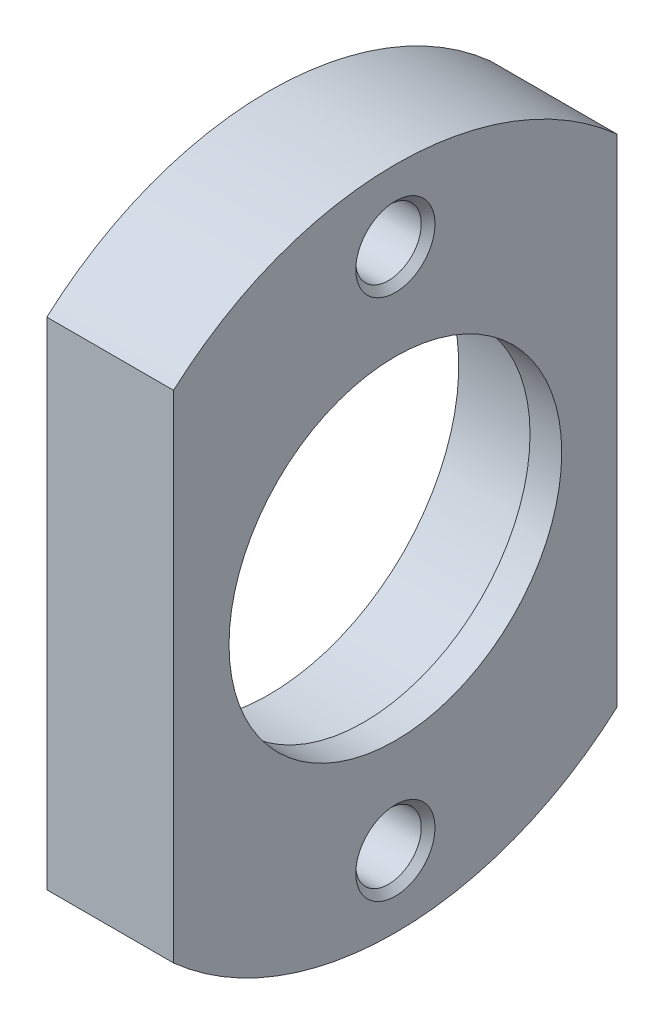
ISO-10303-21;
HEADER;
FILE_DESCRIPTION(('STEP AP214'),'2;1');
FILE_NAME('part.step','',(''),(''),'','','');
FILE_SCHEMA(('AUTOMOTIVE_DESIGN { 1 0 10303 214 1 1 1 1 }'));
ENDSEC;
DATA;
#1=APPLICATION_CONTEXT('core data for automotive mechanical design processes');
#2=APPLICATION_PROTOCOL_DEFINITION('international standard','automotive_design',2000,#1);
#3=PRODUCT_CONTEXT('',#1,'mechanical');
#4=PRODUCT('Part','Part','',(#3));
#5=PRODUCT_RELATED_PRODUCT_CATEGORY('part','',(#4));
#6=PRODUCT_DEFINITION_FORMATION('','',#4);
#7=PRODUCT_DEFINITION_CONTEXT('part definition',#1,'design');
#8=PRODUCT_DEFINITION('design','',#6,#7);
#9=PRODUCT_DEFINITION_SHAPE('','',#8);
#10=(LENGTH_UNIT() NAMED_UNIT(*) SI_UNIT(.MILLI.,.METRE.));
#11=(NAMED_UNIT(*) PLANE_ANGLE_UNIT() SI_UNIT($,.RADIAN.));
#12=(NAMED_UNIT(*) SI_UNIT($,.STERADIAN.) SOLID_ANGLE_UNIT());
#13=UNCERTAINTY_MEASURE_WITH_UNIT(LENGTH_MEASURE(1.E-05),#10,'distance_accuracy_value','');
#14=(GEOMETRIC_REPRESENTATION_CONTEXT(3) GLOBAL_UNCERTAINTY_ASSIGNED_CONTEXT((#13)) GLOBAL_UNIT_ASSIGNED_CONTEXT((#10,
#11,#12)) REPRESENTATION_CONTEXT('',''));
#15=CARTESIAN_POINT('',(0.,0.,0.));
#16=DIRECTION('',(0.,0.,1.));
#17=DIRECTION('',(1.,0.,0.));
#18=AXIS2_PLACEMENT_3D('',#15,#16,#17);
#19=CARTESIAN_POINT('',(4.,1.37737043992558E-12,0.));
#20=DIRECTION('',(1.,0.,0.));
#21=DIRECTION('',(0.,0.,-1.));
#22=AXIS2_PLACEMENT_3D('',#19,#20,#21);
#23=PLANE('',#22);
#24=CARTESIAN_POINT('',(4.,-16.5,0.));
#25=DIRECTION('',(-1.,0.,0.));
#26=DIRECTION('',(0.,0.,1.));
#27=AXIS2_PLACEMENT_3D('',#24,#25,#26);
#28=CIRCLE('',#27,2.5);
#29=CARTESIAN_POINT('',(4.,-16.5,2.5));
#30=VERTEX_POINT('',#29);
#31=EDGE_CURVE('E136',#30,#30,#28,.T.);
#32=ORIENTED_EDGE('',*,*,#31,.T.);
#33=EDGE_LOOP('',(#32));
#34=FACE_BOUND('',#33,.T.);
#35=CARTESIAN_POINT('',(4.,1.37737043992558E-12,0.));
#36=DIRECTION('',(1.,0.,0.));
#37=DIRECTION('',(0.,0.,-1.));
#38=AXIS2_PLACEMENT_3D('',#35,#36,#37);
#39=CIRCLE('',#38,21.0000000000014);
#40=CARTESIAN_POINT('',(4.,-15.652475842499,14.));
#41=VERTEX_POINT('',#40);
#42=CARTESIAN_POINT('',(4.,-15.652475842499,-14.));
#43=VERTEX_POINT('',#42);
#44=EDGE_CURVE('E102',#41,#43,#39,.T.);
#45=ORIENTED_EDGE('',*,*,#44,.T.);
#46=DIRECTION('',(0.,1.,0.));
#47=VECTOR('',#46,1.);
#48=CARTESIAN_POINT('',(4.,-15.652475842499,-14.));
#49=LINE('',#48,#47);
#50=CARTESIAN_POINT('',(4.,15.652475842499,-14.));
#51=VERTEX_POINT('',#50);
#52=EDGE_CURVE('E76',#43,#51,#49,.T.);
#53=ORIENTED_EDGE('',*,*,#52,.T.);
#54=CARTESIAN_POINT('',(4.,1.37737043992558E-12,0.));
#55=DIRECTION('',(1.,0.,0.));
#56=DIRECTION('',(0.,0.,-1.));
#57=AXIS2_PLACEMENT_3D('',#54,#55,#56);
#58=CIRCLE('',#57,20.9999999999993);
#59=CARTESIAN_POINT('',(4.,15.652475842499,14.));
#60=VERTEX_POINT('',#59);
#61=EDGE_CURVE('E52',#51,#60,#58,.T.);
#62=ORIENTED_EDGE('',*,*,#61,.T.);
#63=DIRECTION('',(0.,-1.,0.));
#64=VECTOR('',#63,1.);
#65=CARTESIAN_POINT('',(4.,15.652475842499,14.));
#66=LINE('',#65,#64);
#67=EDGE_CURVE('E47',#60,#41,#66,.T.);
#68=ORIENTED_EDGE('',*,*,#67,.T.);
#69=EDGE_LOOP('',(#45,#53,#62,#68));
#70=FACE_BOUND('',#69,.T.);
#71=CARTESIAN_POINT('',(4.,0.,0.));
#72=DIRECTION('',(-1.,0.,0.));
#73=DIRECTION('',(0.,0.,1.));
#74=AXIS2_PLACEMENT_3D('',#71,#72,#73);
#75=CIRCLE('',#74,10.5);
#76=CARTESIAN_POINT('',(4.,0.,10.5));
#77=VERTEX_POINT('',#76);
#78=EDGE_CURVE('E120',#77,#77,#75,.T.);
#79=ORIENTED_EDGE('',*,*,#78,.T.);
#80=EDGE_LOOP('',(#79));
#81=FACE_BOUND('',#80,.T.);
#82=CARTESIAN_POINT('',(4.,16.5,0.));
#83=DIRECTION('',(-1.,0.,0.));
#84=DIRECTION('',(0.,0.,1.));
#85=AXIS2_PLACEMENT_3D('',#82,#83,#84);
#86=CIRCLE('',#85,2.5);
#87=CARTESIAN_POINT('',(4.,16.5,2.5));
#88=VERTEX_POINT('',#87);
#89=EDGE_CURVE('E123',#88,#88,#86,.T.);
#90=ORIENTED_EDGE('',*,*,#89,.T.);
#91=EDGE_LOOP('',(#90));
#92=FACE_BOUND('',#91,.T.);
#93=ADVANCED_FACE('F32',(#34,#70,#81,#92),#23,.T.);
#94=CARTESIAN_POINT('',(-4.,1.37737043992558E-12,0.));
#95=DIRECTION('',(1.,0.,0.));
#96=DIRECTION('',(0.,0.,-1.));
#97=AXIS2_PLACEMENT_3D('',#94,#95,#96);
#98=PLANE('',#97);
#99=CARTESIAN_POINT('',(-4.,-16.5,0.));
#100=DIRECTION('',(-1.,0.,0.));
#101=DIRECTION('',(0.,0.,1.));
#102=AXIS2_PLACEMENT_3D('',#99,#100,#101);
#103=CIRCLE('',#102,2.5);
#104=CARTESIAN_POINT('',(-4.,-16.5,2.5));
#105=VERTEX_POINT('',#104);
#106=EDGE_CURVE('E145',#105,#105,#103,.T.);
#107=ORIENTED_EDGE('',*,*,#106,.F.);
#108=EDGE_LOOP('',(#107));
#109=FACE_BOUND('',#108,.T.);
#110=CARTESIAN_POINT('',(-4.,1.37737043992558E-12,0.));
#111=DIRECTION('',(1.,0.,0.));
#112=DIRECTION('',(0.,0.,-1.));
#113=AXIS2_PLACEMENT_3D('',#110,#111,#112);
#114=CIRCLE('',#113,21.0000000000014);
#115=CARTESIAN_POINT('',(-4.,-15.652475842499,14.));
#116=VERTEX_POINT('',#115);
#117=CARTESIAN_POINT('',(-4.,-15.652475842499,-14.));
#118=VERTEX_POINT('',#117);
#119=EDGE_CURVE('E86',#116,#118,#114,.T.);
#120=ORIENTED_EDGE('',*,*,#119,.F.);
#121=DIRECTION('',(0.,-1.,0.));
#122=VECTOR('',#121,1.);
#123=CARTESIAN_POINT('',(-4.,15.652475842499,14.));
#124=LINE('',#123,#122);
#125=CARTESIAN_POINT('',(-4.,15.652475842499,14.));
#126=VERTEX_POINT('',#125);
#127=EDGE_CURVE('E100',#126,#116,#124,.T.);
#128=ORIENTED_EDGE('',*,*,#127,.F.);
#129=CARTESIAN_POINT('',(-4.,1.37737043992558E-12,0.));
#130=DIRECTION('',(1.,0.,0.));
#131=DIRECTION('',(0.,0.,-1.));
#132=AXIS2_PLACEMENT_3D('',#129,#130,#131);
#133=CIRCLE('',#132,20.9999999999993);
#134=CARTESIAN_POINT('',(-4.,15.652475842499,-14.));
#135=VERTEX_POINT('',#134);
#136=EDGE_CURVE('E89',#135,#126,#133,.T.);
#137=ORIENTED_EDGE('',*,*,#136,.F.);
#138=DIRECTION('',(0.,1.,0.));
#139=VECTOR('',#138,1.);
#140=CARTESIAN_POINT('',(-4.,-15.652475842499,-14.));
#141=LINE('',#140,#139);
#142=EDGE_CURVE('E75',#118,#135,#141,.T.);
#143=ORIENTED_EDGE('',*,*,#142,.F.);
#144=EDGE_LOOP('',(#120,#128,#137,#143));
#145=FACE_BOUND('',#144,.T.);
#146=CARTESIAN_POINT('',(-4.,0.,0.));
#147=DIRECTION('',(-1.,0.,0.));
#148=DIRECTION('',(0.,0.,1.));
#149=AXIS2_PLACEMENT_3D('',#146,#147,#148);
#150=CIRCLE('',#149,12.);
#151=CARTESIAN_POINT('',(-4.,0.,12.));
#152=VERTEX_POINT('',#151);
#153=EDGE_CURVE('E92',#152,#152,#150,.T.);
#154=ORIENTED_EDGE('',*,*,#153,.F.);
#155=EDGE_LOOP('',(#154));
#156=FACE_BOUND('',#155,.T.);
#157=CARTESIAN_POINT('',(-4.,16.5,0.));
#158=DIRECTION('',(-1.,0.,0.));
#159=DIRECTION('',(0.,0.,1.));
#160=AXIS2_PLACEMENT_3D('',#157,#158,#159);
#161=CIRCLE('',#160,2.5);
#162=CARTESIAN_POINT('',(-4.,16.5,2.5));
#163=VERTEX_POINT('',#162);
#164=EDGE_CURVE('E133',#163,#163,#161,.T.);
#165=ORIENTED_EDGE('',*,*,#164,.F.);
#166=EDGE_LOOP('',(#165));
#167=FACE_BOUND('',#166,.T.);
#168=ADVANCED_FACE('F83',(#109,#145,#156,#167),#98,.F.);
#169=CARTESIAN_POINT('',(4.,1.37737043992558E-12,0.));
#170=DIRECTION('',(-1.,0.,0.));
#171=DIRECTION('',(0.,0.,1.));
#172=AXIS2_PLACEMENT_3D('',#169,#170,#171);
#173=CYLINDRICAL_SURFACE('',#172,21.0000000000014);
#174=DIRECTION('',(-1.,0.,0.));
#175=VECTOR('',#174,1.);
#176=CARTESIAN_POINT('',(4.,-15.652475842499,14.));
#177=LINE('',#176,#175);
#178=EDGE_CURVE('E91',#41,#116,#177,.T.);
#179=ORIENTED_EDGE('',*,*,#178,.T.);
#180=ORIENTED_EDGE('',*,*,#119,.T.);
#181=DIRECTION('',(-1.,0.,0.));
#182=VECTOR('',#181,1.);
#183=CARTESIAN_POINT('',(4.,-15.652475842499,-14.));
#184=LINE('',#183,#182);
#185=EDGE_CURVE('E11',#43,#118,#184,.T.);
#186=ORIENTED_EDGE('',*,*,#185,.F.);
#187=ORIENTED_EDGE('',*,*,#44,.F.);
#188=EDGE_LOOP('',(#179,#180,#186,#187));
#189=FACE_BOUND('',#188,.T.);
#190=ADVANCED_FACE('F34',(#189),#173,.T.);
#191=CARTESIAN_POINT('',(4.,-15.652475842499,-14.));
#192=DIRECTION('',(0.,0.,1.));
#193=DIRECTION('',(1.,0.,0.));
#194=AXIS2_PLACEMENT_3D('',#191,#192,#193);
#195=PLANE('',#194);
#196=ORIENTED_EDGE('',*,*,#185,.T.);
#197=ORIENTED_EDGE('',*,*,#142,.T.);
#198=DIRECTION('',(-1.,0.,0.));
#199=VECTOR('',#198,1.);
#200=CARTESIAN_POINT('',(4.,15.652475842499,-14.));
#201=LINE('',#200,#199);
#202=EDGE_CURVE('E40',#51,#135,#201,.T.);
#203=ORIENTED_EDGE('',*,*,#202,.F.);
#204=ORIENTED_EDGE('',*,*,#52,.F.);
#205=EDGE_LOOP('',(#196,#197,#203,#204));
#206=FACE_BOUND('',#205,.T.);
#207=ADVANCED_FACE('F73',(#206),#195,.F.);
#208=CARTESIAN_POINT('',(4.,1.37737043992558E-12,0.));
#209=DIRECTION('',(-1.,0.,0.));
#210=DIRECTION('',(0.,0.,1.));
#211=AXIS2_PLACEMENT_3D('',#208,#209,#210);
#212=CYLINDRICAL_SURFACE('',#211,20.9999999999993);
#213=ORIENTED_EDGE('',*,*,#202,.T.);
#214=ORIENTED_EDGE('',*,*,#136,.T.);
#215=DIRECTION('',(-1.,0.,0.));
#216=VECTOR('',#215,1.);
#217=CARTESIAN_POINT('',(4.,15.652475842499,14.));
#218=LINE('',#217,#216);
#219=EDGE_CURVE('E108',#60,#126,#218,.T.);
#220=ORIENTED_EDGE('',*,*,#219,.F.);
#221=ORIENTED_EDGE('',*,*,#61,.F.);
#222=EDGE_LOOP('',(#213,#214,#220,#221));
#223=FACE_BOUND('',#222,.T.);
#224=ADVANCED_FACE('F110',(#223),#212,.T.);
#225=CARTESIAN_POINT('',(4.,15.652475842499,14.));
#226=DIRECTION('',(0.,0.,-1.));
#227=DIRECTION('',(-1.,0.,0.));
#228=AXIS2_PLACEMENT_3D('',#225,#226,#227);
#229=PLANE('',#228);
#230=ORIENTED_EDGE('',*,*,#219,.T.);
#231=ORIENTED_EDGE('',*,*,#127,.T.);
#232=ORIENTED_EDGE('',*,*,#178,.F.);
#233=ORIENTED_EDGE('',*,*,#67,.F.);
#234=EDGE_LOOP('',(#230,#231,#232,#233));
#235=FACE_BOUND('',#234,.T.);
#236=ADVANCED_FACE('F112',(#235),#229,.F.);
#237=CARTESIAN_POINT('',(4.,0.,0.));
#238=DIRECTION('',(-1.,0.,0.));
#239=DIRECTION('',(0.,0.,1.));
#240=AXIS2_PLACEMENT_3D('',#237,#238,#239);
#241=CYLINDRICAL_SURFACE('',#240,12.);
#242=ORIENTED_EDGE('',*,*,#153,.T.);
#243=EDGE_LOOP('',(#242));
#244=FACE_BOUND('',#243,.T.);
#245=CARTESIAN_POINT('',(2.,0.,0.));
#246=DIRECTION('',(-1.,0.,0.));
#247=DIRECTION('',(0.,0.,1.));
#248=AXIS2_PLACEMENT_3D('',#245,#246,#247);
#249=CIRCLE('',#248,12.);
#250=CARTESIAN_POINT('',(2.,0.,12.));
#251=VERTEX_POINT('',#250);
#252=EDGE_CURVE('E95',#251,#251,#249,.T.);
#253=ORIENTED_EDGE('',*,*,#252,.F.);
#254=EDGE_LOOP('',(#253));
#255=FACE_BOUND('',#254,.T.);
#256=ADVANCED_FACE('F157',(#244,#255),#241,.F.);
#257=CARTESIAN_POINT('',(2.,12.,0.));
#258=DIRECTION('',(-1.,0.,0.));
#259=DIRECTION('',(0.,0.,1.));
#260=AXIS2_PLACEMENT_3D('',#257,#258,#259);
#261=PLANE('',#260);
#262=ORIENTED_EDGE('',*,*,#252,.T.);
#263=EDGE_LOOP('',(#262));
#264=FACE_BOUND('',#263,.T.);
#265=CARTESIAN_POINT('',(2.,0.,0.));
#266=DIRECTION('',(-1.,0.,0.));
#267=DIRECTION('',(0.,0.,1.));
#268=AXIS2_PLACEMENT_3D('',#265,#266,#267);
#269=CIRCLE('',#268,10.5);
#270=CARTESIAN_POINT('',(2.,0.,10.5));
#271=VERTEX_POINT('',#270);
#272=EDGE_CURVE('E149',#271,#271,#269,.T.);
#273=ORIENTED_EDGE('',*,*,#272,.F.);
#274=EDGE_LOOP('',(#273));
#275=FACE_BOUND('',#274,.T.);
#276=ADVANCED_FACE('F154',(#264,#275),#261,.T.);
#277=CARTESIAN_POINT('',(4.,0.,0.));
#278=DIRECTION('',(-1.,0.,0.));
#279=DIRECTION('',(0.,0.,1.));
#280=AXIS2_PLACEMENT_3D('',#277,#278,#279);
#281=CYLINDRICAL_SURFACE('',#280,10.5);
#282=ORIENTED_EDGE('',*,*,#272,.T.);
#283=EDGE_LOOP('',(#282));
#284=FACE_BOUND('',#283,.T.);
#285=ORIENTED_EDGE('',*,*,#78,.F.);
#286=EDGE_LOOP('',(#285));
#287=FACE_BOUND('',#286,.T.);
#288=ADVANCED_FACE('F165',(#284,#287),#281,.F.);
#289=CARTESIAN_POINT('',(-3.567,-16.5,0.));
#290=DIRECTION('',(-1.,0.,0.));
#291=DIRECTION('',(0.,0.,1.));
#292=AXIS2_PLACEMENT_3D('',#289,#290,#291);
#293=CONICAL_SURFACE('',#292,2.067,0.785398163397447);
#294=ORIENTED_EDGE('',*,*,#106,.T.);
#295=EDGE_LOOP('',(#294));
#296=FACE_BOUND('',#295,.T.);
#297=CARTESIAN_POINT('',(-3.567,-16.5,0.));
#298=DIRECTION('',(-1.,0.,0.));
#299=DIRECTION('',(0.,0.,1.));
#300=AXIS2_PLACEMENT_3D('',#297,#298,#299);
#301=CIRCLE('',#300,2.067);
#302=CARTESIAN_POINT('',(-3.567,-16.5,2.067));
#303=VERTEX_POINT('',#302);
#304=EDGE_CURVE('E142',#303,#303,#301,.T.);
#305=ORIENTED_EDGE('',*,*,#304,.F.);
#306=EDGE_LOOP('',(#305));
#307=FACE_BOUND('',#306,.T.);
#308=ADVANCED_FACE('F212',(#296,#307),#293,.F.);
#309=CARTESIAN_POINT('',(4.,-16.5,0.));
#310=DIRECTION('',(-1.,0.,0.));
#311=DIRECTION('',(0.,0.,1.));
#312=AXIS2_PLACEMENT_3D('',#309,#310,#311);
#313=CYLINDRICAL_SURFACE('',#312,2.067);
#314=ORIENTED_EDGE('',*,*,#304,.T.);
#315=EDGE_LOOP('',(#314));
#316=FACE_BOUND('',#315,.T.);
#317=CARTESIAN_POINT('',(3.567,-16.5,0.));
#318=DIRECTION('',(-1.,0.,0.));
#319=DIRECTION('',(0.,0.,1.));
#320=AXIS2_PLACEMENT_3D('',#317,#318,#319);
#321=CIRCLE('',#320,2.067);
#322=CARTESIAN_POINT('',(3.567,-16.5,2.067));
#323=VERTEX_POINT('',#322);
#324=EDGE_CURVE('E139',#323,#323,#321,.T.);
#325=ORIENTED_EDGE('',*,*,#324,.F.);
#326=EDGE_LOOP('',(#325));
#327=FACE_BOUND('',#326,.T.);
#328=ADVANCED_FACE('F201',(#316,#327),#313,.F.);
#329=CARTESIAN_POINT('',(4.,-16.5,0.));
#330=DIRECTION('',(1.,0.,0.));
#331=DIRECTION('',(0.,0.,-1.));
#332=AXIS2_PLACEMENT_3D('',#329,#330,#331);
#333=CONICAL_SURFACE('',#332,2.5,0.785398163397447);
#334=ORIENTED_EDGE('',*,*,#324,.T.);
#335=EDGE_LOOP('',(#334));
#336=FACE_BOUND('',#335,.T.);
#337=ORIENTED_EDGE('',*,*,#31,.F.);
#338=EDGE_LOOP('',(#337));
#339=FACE_BOUND('',#338,.T.);
#340=ADVANCED_FACE('F195',(#336,#339),#333,.F.);
#341=CARTESIAN_POINT('',(-3.567,16.5,0.));
#342=DIRECTION('',(-1.,0.,0.));
#343=DIRECTION('',(0.,0.,1.));
#344=AXIS2_PLACEMENT_3D('',#341,#342,#343);
#345=CONICAL_SURFACE('',#344,2.067,0.785398163397447);
#346=ORIENTED_EDGE('',*,*,#164,.T.);
#347=EDGE_LOOP('',(#346));
#348=FACE_BOUND('',#347,.T.);
#349=CARTESIAN_POINT('',(-3.567,16.5,0.));
#350=DIRECTION('',(-1.,0.,0.));
#351=DIRECTION('',(0.,0.,1.));
#352=AXIS2_PLACEMENT_3D('',#349,#350,#351);
#353=CIRCLE('',#352,2.067);
#354=CARTESIAN_POINT('',(-3.567,16.5,2.067));
#355=VERTEX_POINT('',#354);
#356=EDGE_CURVE('E128',#355,#355,#353,.T.);
#357=ORIENTED_EDGE('',*,*,#356,.F.);
#358=EDGE_LOOP('',(#357));
#359=FACE_BOUND('',#358,.T.);
#360=ADVANCED_FACE('F200',(#348,#359),#345,.F.);
#361=CARTESIAN_POINT('',(4.,16.5,0.));
#362=DIRECTION('',(-1.,0.,0.));
#363=DIRECTION('',(0.,0.,1.));
#364=AXIS2_PLACEMENT_3D('',#361,#362,#363);
#365=CYLINDRICAL_SURFACE('',#364,2.067);
#366=ORIENTED_EDGE('',*,*,#356,.T.);
#367=EDGE_LOOP('',(#366));
#368=FACE_BOUND('',#367,.T.);
#369=CARTESIAN_POINT('',(3.567,16.5,0.));
#370=DIRECTION('',(-1.,0.,0.));
#371=DIRECTION('',(0.,0.,1.));
#372=AXIS2_PLACEMENT_3D('',#369,#370,#371);
#373=CIRCLE('',#372,2.067);
#374=CARTESIAN_POINT('',(3.567,16.5,2.067));
#375=VERTEX_POINT('',#374);
#376=EDGE_CURVE('E125',#375,#375,#373,.T.);
#377=ORIENTED_EDGE('',*,*,#376,.F.);
#378=EDGE_LOOP('',(#377));
#379=FACE_BOUND('',#378,.T.);
#380=ADVANCED_FACE('F277',(#368,#379),#365,.F.);
#381=CARTESIAN_POINT('',(4.,16.5,0.));
#382=DIRECTION('',(1.,0.,0.));
#383=DIRECTION('',(0.,0.,-1.));
#384=AXIS2_PLACEMENT_3D('',#381,#382,#383);
#385=CONICAL_SURFACE('',#384,2.5,0.785398163397447);
#386=ORIENTED_EDGE('',*,*,#376,.T.);
#387=EDGE_LOOP('',(#386));
#388=FACE_BOUND('',#387,.T.);
#389=ORIENTED_EDGE('',*,*,#89,.F.);
#390=EDGE_LOOP('',(#389));
#391=FACE_BOUND('',#390,.T.);
#392=ADVANCED_FACE('F281',(#388,#391),#385,.F.);
#393=CLOSED_SHELL('',(#93,#168,#190,#207,#224,#236,#256,#276,#288,#308,#328,#340,#360,#380,#392));
#394=MANIFOLD_SOLID_BREP('B2',#393);
#395=ADVANCED_BREP_SHAPE_REPRESENTATION('',(#18,#394),#14);
#396=SHAPE_DEFINITION_REPRESENTATION(#9,#395);
ENDSEC;
END-ISO-10303-21;
